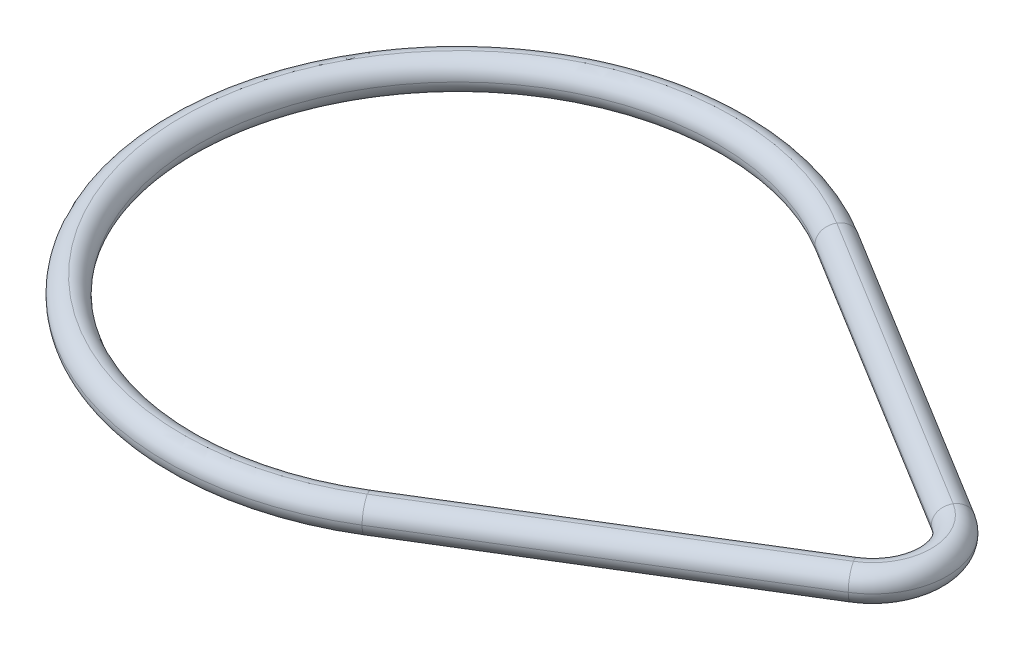
ISO-10303-21;
HEADER;
FILE_DESCRIPTION(('STEP AP214'),'2;1');
FILE_NAME('part.step','',(''),(''),'','','');
FILE_SCHEMA(('AUTOMOTIVE_DESIGN { 1 0 10303 214 1 1 1 1 }'));
ENDSEC;
DATA;
#1=APPLICATION_CONTEXT('core data for automotive mechanical design processes');
#2=APPLICATION_PROTOCOL_DEFINITION('international standard','automotive_design',2000,#1);
#3=PRODUCT_CONTEXT('',#1,'mechanical');
#4=PRODUCT('Part','Part','',(#3));
#5=PRODUCT_RELATED_PRODUCT_CATEGORY('part','',(#4));
#6=PRODUCT_DEFINITION_FORMATION('','',#4);
#7=PRODUCT_DEFINITION_CONTEXT('part definition',#1,'design');
#8=PRODUCT_DEFINITION('design','',#6,#7);
#9=PRODUCT_DEFINITION_SHAPE('','',#8);
#10=(LENGTH_UNIT() NAMED_UNIT(*) SI_UNIT(.MILLI.,.METRE.));
#11=(NAMED_UNIT(*) PLANE_ANGLE_UNIT() SI_UNIT($,.RADIAN.));
#12=(NAMED_UNIT(*) SI_UNIT($,.STERADIAN.) SOLID_ANGLE_UNIT());
#13=UNCERTAINTY_MEASURE_WITH_UNIT(LENGTH_MEASURE(1.E-05),#10,'distance_accuracy_value','');
#14=(GEOMETRIC_REPRESENTATION_CONTEXT(3) GLOBAL_UNCERTAINTY_ASSIGNED_CONTEXT((#13)) GLOBAL_UNIT_ASSIGNED_CONTEXT((#10,
#11,#12)) REPRESENTATION_CONTEXT('',''));
#15=CARTESIAN_POINT('',(0.,0.,0.));
#16=DIRECTION('',(0.,0.,1.));
#17=DIRECTION('',(1.,0.,0.));
#18=AXIS2_PLACEMENT_3D('',#15,#16,#17);
#19=CARTESIAN_POINT('',(6.77384615384616,0.,11.0370969137733));
#20=DIRECTION('',(0.852285475967049,0.,-0.523076923076923));
#21=DIRECTION('',(-0.523076923076923,0.,-0.852285475967049));
#22=AXIS2_PLACEMENT_3D('',#19,#20,#21);
#23=CYLINDRICAL_SURFACE('',#22,0.75);
#24=CARTESIAN_POINT('',(20.9384615384615,0.,2.34378505890938));
#25=DIRECTION('',(0.852285475967049,0.,-0.523076923076922));
#26=DIRECTION('',(-0.523076923076922,0.,-0.852285475967049));
#27=AXIS2_PLACEMENT_3D('',#24,#25,#26);
#28=CIRCLE('',#27,0.75);
#29=CARTESIAN_POINT('',(20.9384615384615,-0.75,2.34378505890938));
#30=VERTEX_POINT('',#29);
#31=CARTESIAN_POINT('',(20.5461538461538,0.,1.7045709519341));
#32=VERTEX_POINT('',#31);
#33=EDGE_CURVE('E12',#30,#32,#28,.T.);
#34=ORIENTED_EDGE('',*,*,#33,.F.);
#35=DIRECTION('',(0.852285475967049,0.,-0.523076923076923));
#36=VECTOR('',#35,1.);
#37=CARTESIAN_POINT('',(6.77384615384616,-0.75,11.0370969137733));
#38=LINE('',#37,#36);
#39=CARTESIAN_POINT('',(6.77384615384614,-0.75,11.0370969137733));
#40=VERTEX_POINT('',#39);
#41=EDGE_CURVE('E215',#40,#30,#38,.T.);
#42=ORIENTED_EDGE('',*,*,#41,.F.);
#43=CARTESIAN_POINT('',(6.77384615384615,0.,11.0370969137733));
#44=DIRECTION('',(-0.852285475967049,0.,0.523076923076923));
#45=DIRECTION('',(0.523076923076923,0.,0.852285475967049));
#46=AXIS2_PLACEMENT_3D('',#43,#44,#45);
#47=CIRCLE('',#46,0.75);
#48=CARTESIAN_POINT('',(6.38153846153846,0.,10.397882806798));
#49=VERTEX_POINT('',#48);
#50=EDGE_CURVE('E212',#49,#40,#47,.T.);
#51=ORIENTED_EDGE('',*,*,#50,.F.);
#52=DIRECTION('',(0.852285475967049,0.,-0.523076923076923));
#53=VECTOR('',#52,1.);
#54=CARTESIAN_POINT('',(20.5461538461538,0.,1.7045709519341));
#55=LINE('',#54,#53);
#56=EDGE_CURVE('E64',#32,#49,#55,.F.);
#57=ORIENTED_EDGE('',*,*,#56,.F.);
#58=EDGE_LOOP('',(#34,#42,#51,#57));
#59=FACE_BOUND('',#58,.T.);
#60=ADVANCED_FACE('F57',(#59),#23,.T.);
#61=CARTESIAN_POINT('',(19.5,0.,0.));
#62=DIRECTION('',(0.,-1.,0.));
#63=DIRECTION('',(0.,0.,-1.));
#64=AXIS2_PLACEMENT_3D('',#61,#62,#63);
#65=TOROIDAL_SURFACE('',#64,2.75,0.75);
#66=CARTESIAN_POINT('',(19.5,-0.75,0.));
#67=DIRECTION('',(0.,-1.,0.));
#68=DIRECTION('',(0.,0.,-1.));
#69=AXIS2_PLACEMENT_3D('',#66,#67,#68);
#70=CIRCLE('',#69,2.75);
#71=CARTESIAN_POINT('',(20.9384615384615,-0.75,-2.34378505890938));
#72=VERTEX_POINT('',#71);
#73=EDGE_CURVE('E210',#30,#72,#70,.F.);
#74=ORIENTED_EDGE('',*,*,#73,.F.);
#75=ORIENTED_EDGE('',*,*,#33,.T.);
#76=CARTESIAN_POINT('',(19.5,0.,0.));
#77=DIRECTION('',(0.,-1.,0.));
#78=DIRECTION('',(0.,0.,-1.));
#79=AXIS2_PLACEMENT_3D('',#76,#77,#78);
#80=CIRCLE('',#79,2.);
#81=CARTESIAN_POINT('',(20.5461538461538,0.,-1.7045709519341));
#82=VERTEX_POINT('',#81);
#83=EDGE_CURVE('E202',#82,#32,#80,.T.);
#84=ORIENTED_EDGE('',*,*,#83,.F.);
#85=CARTESIAN_POINT('',(20.9384615384615,0.,-2.34378505890938));
#86=DIRECTION('',(-0.852285475967049,0.,-0.523076923076923));
#87=DIRECTION('',(-0.523076923076923,0.,0.852285475967049));
#88=AXIS2_PLACEMENT_3D('',#85,#86,#87);
#89=CIRCLE('',#88,0.75);
#90=EDGE_CURVE('E199',#72,#82,#89,.T.);
#91=ORIENTED_EDGE('',*,*,#90,.F.);
#92=EDGE_LOOP('',(#74,#75,#84,#91));
#93=FACE_BOUND('',#92,.T.);
#94=ADVANCED_FACE('F247',(#93),#65,.T.);
#95=CARTESIAN_POINT('',(20.9384615384615,0.,2.34378505890938));
#96=DIRECTION('',(-0.852285475967049,0.,0.523076923076923));
#97=DIRECTION('',(0.523076923076923,0.,0.852285475967049));
#98=AXIS2_PLACEMENT_3D('',#95,#96,#97);
#99=CYLINDRICAL_SURFACE('',#98,0.75);
#100=CARTESIAN_POINT('',(20.9384615384615,0.,2.34378505890938));
#101=DIRECTION('',(0.852285475967049,0.,-0.523076923076923));
#102=DIRECTION('',(-0.523076923076923,0.,-0.852285475967049));
#103=AXIS2_PLACEMENT_3D('',#100,#101,#102);
#104=CIRCLE('',#103,0.75);
#105=CARTESIAN_POINT('',(20.9384615384615,0.75,2.34378505890938));
#106=VERTEX_POINT('',#105);
#107=EDGE_CURVE('E205',#32,#106,#104,.T.);
#108=ORIENTED_EDGE('',*,*,#107,.F.);
#109=ORIENTED_EDGE('',*,*,#56,.T.);
#110=CARTESIAN_POINT('',(6.77384615384615,0.,11.0370969137733));
#111=DIRECTION('',(-0.852285475967049,0.,0.523076923076922));
#112=DIRECTION('',(0.523076923076922,0.,0.852285475967049));
#113=AXIS2_PLACEMENT_3D('',#110,#111,#112);
#114=CIRCLE('',#113,0.75);
#115=CARTESIAN_POINT('',(6.77384615384614,0.75,11.0370969137733));
#116=VERTEX_POINT('',#115);
#117=EDGE_CURVE('E194',#116,#49,#114,.T.);
#118=ORIENTED_EDGE('',*,*,#117,.F.);
#119=DIRECTION('',(0.852285475967049,0.,-0.523076923076923));
#120=VECTOR('',#119,1.);
#121=CARTESIAN_POINT('',(6.77384615384615,0.75,11.0370969137733));
#122=LINE('',#121,#120);
#123=EDGE_CURVE('E191',#106,#116,#122,.F.);
#124=ORIENTED_EDGE('',*,*,#123,.F.);
#125=EDGE_LOOP('',(#108,#109,#118,#124));
#126=FACE_BOUND('',#125,.T.);
#127=ADVANCED_FACE('F219',(#126),#99,.T.);
#128=CARTESIAN_POINT('',(6.77384615384615,0.,11.0370969137733));
#129=DIRECTION('',(-0.852285475967049,0.,0.523076923076923));
#130=DIRECTION('',(0.523076923076923,0.,0.852285475967049));
#131=AXIS2_PLACEMENT_3D('',#128,#129,#130);
#132=CYLINDRICAL_SURFACE('',#131,0.75);
#133=CARTESIAN_POINT('',(6.77384615384614,0.,11.0370969137733));
#134=DIRECTION('',(-0.852285475967049,0.,0.523076923076923));
#135=DIRECTION('',(0.523076923076923,0.,0.852285475967049));
#136=AXIS2_PLACEMENT_3D('',#133,#134,#135);
#137=CIRCLE('',#136,0.75);
#138=CARTESIAN_POINT('',(7.16615384615384,0.,11.6763110207486));
#139=VERTEX_POINT('',#138);
#140=EDGE_CURVE('E185',#40,#139,#137,.T.);
#141=ORIENTED_EDGE('',*,*,#140,.F.);
#142=ORIENTED_EDGE('',*,*,#41,.T.);
#143=CARTESIAN_POINT('',(20.9384615384615,0.,2.34378505890938));
#144=DIRECTION('',(0.852285475967049,0.,-0.523076923076923));
#145=DIRECTION('',(-0.523076923076923,0.,-0.852285475967049));
#146=AXIS2_PLACEMENT_3D('',#143,#144,#145);
#147=CIRCLE('',#146,0.75);
#148=CARTESIAN_POINT('',(21.3307692307692,0.,2.98299916588467));
#149=VERTEX_POINT('',#148);
#150=EDGE_CURVE('E207',#149,#30,#147,.T.);
#151=ORIENTED_EDGE('',*,*,#150,.F.);
#152=DIRECTION('',(0.852285475967049,0.,-0.523076923076923));
#153=VECTOR('',#152,1.);
#154=CARTESIAN_POINT('',(21.3307692307692,0.,2.98299916588467));
#155=LINE('',#154,#153);
#156=EDGE_CURVE('E188',#139,#149,#155,.T.);
#157=ORIENTED_EDGE('',*,*,#156,.F.);
#158=EDGE_LOOP('',(#141,#142,#151,#157));
#159=FACE_BOUND('',#158,.T.);
#160=ADVANCED_FACE('F245',(#159),#132,.T.);
#161=CARTESIAN_POINT('',(0.,0.,0.));
#162=DIRECTION('',(0.,-1.,0.));
#163=DIRECTION('',(0.,0.,-1.));
#164=AXIS2_PLACEMENT_3D('',#161,#162,#163);
#165=TOROIDAL_SURFACE('',#164,12.95,0.75);
#166=CARTESIAN_POINT('',(0.,0.,0.));
#167=DIRECTION('',(0.,-1.,0.));
#168=DIRECTION('',(0.,0.,-1.));
#169=AXIS2_PLACEMENT_3D('',#166,#167,#168);
#170=CIRCLE('',#169,12.2);
#171=CARTESIAN_POINT('',(6.38153846153846,0.,-10.397882806798));
#172=VERTEX_POINT('',#171);
#173=EDGE_CURVE('E125',#49,#172,#170,.T.);
#174=ORIENTED_EDGE('',*,*,#173,.F.);
#175=ORIENTED_EDGE('',*,*,#50,.T.);
#176=CARTESIAN_POINT('',(0.,-0.75,0.));
#177=DIRECTION('',(0.,-1.,0.));
#178=DIRECTION('',(0.,0.,-1.));
#179=AXIS2_PLACEMENT_3D('',#176,#177,#178);
#180=CIRCLE('',#179,12.95);
#181=CARTESIAN_POINT('',(6.77384615384615,-0.75,-11.0370969137733));
#182=VERTEX_POINT('',#181);
#183=EDGE_CURVE('E182',#182,#40,#180,.F.);
#184=ORIENTED_EDGE('',*,*,#183,.F.);
#185=CARTESIAN_POINT('',(6.77384615384615,0.,-11.0370969137733));
#186=DIRECTION('',(0.852285475967049,0.,0.523076923076922));
#187=DIRECTION('',(0.523076923076922,0.,-0.852285475967049));
#188=AXIS2_PLACEMENT_3D('',#185,#186,#187);
#189=CIRCLE('',#188,0.75);
#190=EDGE_CURVE('E197',#172,#182,#189,.T.);
#191=ORIENTED_EDGE('',*,*,#190,.F.);
#192=EDGE_LOOP('',(#174,#175,#184,#191));
#193=FACE_BOUND('',#192,.T.);
#194=ADVANCED_FACE('F224',(#193),#165,.T.);
#195=CARTESIAN_POINT('',(19.5,0.,0.));
#196=DIRECTION('',(0.,-1.,0.));
#197=DIRECTION('',(0.,0.,-1.));
#198=AXIS2_PLACEMENT_3D('',#195,#196,#197);
#199=TOROIDAL_SURFACE('',#198,2.75,0.75);
#200=ORIENTED_EDGE('',*,*,#150,.T.);
#201=ORIENTED_EDGE('',*,*,#73,.T.);
#202=CARTESIAN_POINT('',(20.9384615384615,0.,-2.34378505890938));
#203=DIRECTION('',(-0.852285475967049,0.,-0.523076923076923));
#204=DIRECTION('',(-0.523076923076923,0.,0.852285475967049));
#205=AXIS2_PLACEMENT_3D('',#202,#203,#204);
#206=CIRCLE('',#205,0.75);
#207=CARTESIAN_POINT('',(21.3307692307692,0.,-2.98299916588467));
#208=VERTEX_POINT('',#207);
#209=EDGE_CURVE('E174',#208,#72,#206,.T.);
#210=ORIENTED_EDGE('',*,*,#209,.F.);
#211=CARTESIAN_POINT('',(19.5,0.,0.));
#212=DIRECTION('',(0.,-1.,0.));
#213=DIRECTION('',(0.,0.,-1.));
#214=AXIS2_PLACEMENT_3D('',#211,#212,#213);
#215=CIRCLE('',#214,3.5);
#216=EDGE_CURVE('E171',#149,#208,#215,.F.);
#217=ORIENTED_EDGE('',*,*,#216,.F.);
#218=EDGE_LOOP('',(#200,#201,#210,#217));
#219=FACE_BOUND('',#218,.T.);
#220=ADVANCED_FACE('F246',(#219),#199,.T.);
#221=CARTESIAN_POINT('',(19.5,0.,0.));
#222=DIRECTION('',(0.,-1.,0.));
#223=DIRECTION('',(0.,0.,-1.));
#224=AXIS2_PLACEMENT_3D('',#221,#222,#223);
#225=TOROIDAL_SURFACE('',#224,2.75,0.75);
#226=ORIENTED_EDGE('',*,*,#83,.T.);
#227=ORIENTED_EDGE('',*,*,#107,.T.);
#228=CARTESIAN_POINT('',(19.5,0.75,0.));
#229=DIRECTION('',(0.,-1.,0.));
#230=DIRECTION('',(0.,0.,-1.));
#231=AXIS2_PLACEMENT_3D('',#228,#229,#230);
#232=CIRCLE('',#231,2.75);
#233=CARTESIAN_POINT('',(20.9384615384615,0.75,-2.34378505890938));
#234=VERTEX_POINT('',#233);
#235=EDGE_CURVE('E165',#234,#106,#232,.T.);
#236=ORIENTED_EDGE('',*,*,#235,.F.);
#237=CARTESIAN_POINT('',(20.9384615384615,0.,-2.34378505890938));
#238=DIRECTION('',(-0.852285475967049,0.,-0.523076923076923));
#239=DIRECTION('',(-0.523076923076923,0.,0.852285475967049));
#240=AXIS2_PLACEMENT_3D('',#237,#238,#239);
#241=CIRCLE('',#240,0.75);
#242=EDGE_CURVE('E146',#82,#234,#241,.T.);
#243=ORIENTED_EDGE('',*,*,#242,.F.);
#244=EDGE_LOOP('',(#226,#227,#236,#243));
#245=FACE_BOUND('',#244,.T.);
#246=ADVANCED_FACE('F231',(#245),#225,.T.);
#247=CARTESIAN_POINT('',(6.77384615384615,0.,-11.0370969137733));
#248=DIRECTION('',(-0.852285475967049,0.,-0.523076923076923));
#249=DIRECTION('',(-0.523076923076923,0.,0.852285475967049));
#250=AXIS2_PLACEMENT_3D('',#247,#248,#249);
#251=CYLINDRICAL_SURFACE('',#250,0.75);
#252=DIRECTION('',(-0.852285475967049,0.,-0.523076923076923));
#253=VECTOR('',#252,1.);
#254=CARTESIAN_POINT('',(6.77384615384615,-0.75,-11.0370969137733));
#255=LINE('',#254,#253);
#256=EDGE_CURVE('E177',#72,#182,#255,.T.);
#257=ORIENTED_EDGE('',*,*,#256,.F.);
#258=ORIENTED_EDGE('',*,*,#90,.T.);
#259=DIRECTION('',(-0.852285475967049,0.,-0.523076923076923));
#260=VECTOR('',#259,1.);
#261=CARTESIAN_POINT('',(6.38153846153846,0.,-10.397882806798));
#262=LINE('',#261,#260);
#263=EDGE_CURVE('E130',#172,#82,#262,.F.);
#264=ORIENTED_EDGE('',*,*,#263,.F.);
#265=ORIENTED_EDGE('',*,*,#190,.T.);
#266=EDGE_LOOP('',(#257,#258,#264,#265));
#267=FACE_BOUND('',#266,.T.);
#268=ADVANCED_FACE('F228',(#267),#251,.T.);
#269=CARTESIAN_POINT('',(0.,0.,0.));
#270=DIRECTION('',(0.,-1.,0.));
#271=DIRECTION('',(0.,0.,-1.));
#272=AXIS2_PLACEMENT_3D('',#269,#270,#271);
#273=TOROIDAL_SURFACE('',#272,12.95,0.75);
#274=ORIENTED_EDGE('',*,*,#117,.T.);
#275=ORIENTED_EDGE('',*,*,#173,.T.);
#276=CARTESIAN_POINT('',(6.77384615384615,0.,-11.0370969137733));
#277=DIRECTION('',(0.852285475967049,0.,0.523076923076922));
#278=DIRECTION('',(0.523076923076922,0.,-0.852285475967049));
#279=AXIS2_PLACEMENT_3D('',#276,#277,#278);
#280=CIRCLE('',#279,0.75);
#281=CARTESIAN_POINT('',(6.77384615384615,0.75,-11.0370969137733));
#282=VERTEX_POINT('',#281);
#283=EDGE_CURVE('E118',#282,#172,#280,.T.);
#284=ORIENTED_EDGE('',*,*,#283,.F.);
#285=CARTESIAN_POINT('',(0.,0.75,0.));
#286=DIRECTION('',(0.,-1.,0.));
#287=DIRECTION('',(0.,0.,-1.));
#288=AXIS2_PLACEMENT_3D('',#285,#286,#287);
#289=CIRCLE('',#288,12.95);
#290=EDGE_CURVE('E122',#116,#282,#289,.T.);
#291=ORIENTED_EDGE('',*,*,#290,.F.);
#292=EDGE_LOOP('',(#274,#275,#284,#291));
#293=FACE_BOUND('',#292,.T.);
#294=ADVANCED_FACE('F121',(#293),#273,.T.);
#295=CARTESIAN_POINT('',(6.77384615384615,0.,11.0370969137733));
#296=DIRECTION('',(0.852285475967049,0.,-0.523076923076923));
#297=DIRECTION('',(-0.523076923076923,0.,-0.852285475967049));
#298=AXIS2_PLACEMENT_3D('',#295,#296,#297);
#299=CYLINDRICAL_SURFACE('',#298,0.75);
#300=CARTESIAN_POINT('',(6.77384615384614,0.,11.0370969137733));
#301=DIRECTION('',(-0.852285475967049,0.,0.523076923076923));
#302=DIRECTION('',(0.523076923076923,0.,0.852285475967049));
#303=AXIS2_PLACEMENT_3D('',#300,#301,#302);
#304=CIRCLE('',#303,0.75);
#305=EDGE_CURVE('E139',#139,#116,#304,.T.);
#306=ORIENTED_EDGE('',*,*,#305,.F.);
#307=ORIENTED_EDGE('',*,*,#156,.T.);
#308=CARTESIAN_POINT('',(20.9384615384615,0.,2.34378505890938));
#309=DIRECTION('',(0.852285475967049,0.,-0.523076923076923));
#310=DIRECTION('',(-0.523076923076923,0.,-0.852285475967049));
#311=AXIS2_PLACEMENT_3D('',#308,#309,#310);
#312=CIRCLE('',#311,0.75);
#313=EDGE_CURVE('E168',#106,#149,#312,.T.);
#314=ORIENTED_EDGE('',*,*,#313,.F.);
#315=ORIENTED_EDGE('',*,*,#123,.T.);
#316=EDGE_LOOP('',(#306,#307,#314,#315));
#317=FACE_BOUND('',#316,.T.);
#318=ADVANCED_FACE('F244',(#317),#299,.T.);
#319=CARTESIAN_POINT('',(0.,0.,0.));
#320=DIRECTION('',(0.,-1.,0.));
#321=DIRECTION('',(0.,0.,-1.));
#322=AXIS2_PLACEMENT_3D('',#319,#320,#321);
#323=TOROIDAL_SURFACE('',#322,12.95,0.75);
#324=CARTESIAN_POINT('',(6.77384615384615,0.,-11.0370969137733));
#325=DIRECTION('',(0.852285475967049,0.,0.523076923076922));
#326=DIRECTION('',(0.523076923076922,0.,-0.852285475967049));
#327=AXIS2_PLACEMENT_3D('',#324,#325,#326);
#328=CIRCLE('',#327,0.75);
#329=CARTESIAN_POINT('',(7.16615384615384,0.,-11.6763110207486));
#330=VERTEX_POINT('',#329);
#331=EDGE_CURVE('E180',#182,#330,#328,.T.);
#332=ORIENTED_EDGE('',*,*,#331,.F.);
#333=ORIENTED_EDGE('',*,*,#183,.T.);
#334=ORIENTED_EDGE('',*,*,#140,.T.);
#335=CARTESIAN_POINT('',(0.,0.,0.));
#336=DIRECTION('',(0.,-1.,0.));
#337=DIRECTION('',(0.,0.,-1.));
#338=AXIS2_PLACEMENT_3D('',#335,#336,#337);
#339=CIRCLE('',#338,13.7);
#340=EDGE_CURVE('E160',#330,#139,#339,.F.);
#341=ORIENTED_EDGE('',*,*,#340,.F.);
#342=EDGE_LOOP('',(#332,#333,#334,#341));
#343=FACE_BOUND('',#342,.T.);
#344=ADVANCED_FACE('F241',(#343),#323,.T.);
#345=CARTESIAN_POINT('',(6.77384615384615,0.,-11.0370969137733));
#346=DIRECTION('',(0.852285475967049,0.,0.523076923076923));
#347=DIRECTION('',(0.523076923076923,0.,-0.852285475967049));
#348=AXIS2_PLACEMENT_3D('',#345,#346,#347);
#349=CYLINDRICAL_SURFACE('',#348,0.75);
#350=ORIENTED_EDGE('',*,*,#256,.T.);
#351=ORIENTED_EDGE('',*,*,#331,.T.);
#352=DIRECTION('',(-0.852285475967049,0.,-0.523076923076923));
#353=VECTOR('',#352,1.);
#354=CARTESIAN_POINT('',(7.16615384615384,0.,-11.6763110207486));
#355=LINE('',#354,#353);
#356=EDGE_CURVE('E155',#208,#330,#355,.T.);
#357=ORIENTED_EDGE('',*,*,#356,.F.);
#358=ORIENTED_EDGE('',*,*,#209,.T.);
#359=EDGE_LOOP('',(#350,#351,#357,#358));
#360=FACE_BOUND('',#359,.T.);
#361=ADVANCED_FACE('F238',(#360),#349,.T.);
#362=CARTESIAN_POINT('',(19.5,0.,0.));
#363=DIRECTION('',(0.,-1.,0.));
#364=DIRECTION('',(0.,0.,-1.));
#365=AXIS2_PLACEMENT_3D('',#362,#363,#364);
#366=TOROIDAL_SURFACE('',#365,2.75,0.75);
#367=ORIENTED_EDGE('',*,*,#313,.T.);
#368=ORIENTED_EDGE('',*,*,#216,.T.);
#369=CARTESIAN_POINT('',(20.9384615384615,0.,-2.34378505890939));
#370=DIRECTION('',(-0.852285475967049,0.,-0.523076923076923));
#371=DIRECTION('',(-0.523076923076923,0.,0.852285475967049));
#372=AXIS2_PLACEMENT_3D('',#369,#370,#371);
#373=CIRCLE('',#372,0.75);
#374=EDGE_CURVE('E150',#234,#208,#373,.T.);
#375=ORIENTED_EDGE('',*,*,#374,.F.);
#376=ORIENTED_EDGE('',*,*,#235,.T.);
#377=EDGE_LOOP('',(#367,#368,#375,#376));
#378=FACE_BOUND('',#377,.T.);
#379=ADVANCED_FACE('F233',(#378),#366,.T.);
#380=CARTESIAN_POINT('',(6.77384615384615,0.,-11.0370969137733));
#381=DIRECTION('',(0.852285475967049,0.,0.523076923076923));
#382=DIRECTION('',(0.523076923076923,0.,-0.852285475967049));
#383=AXIS2_PLACEMENT_3D('',#380,#381,#382);
#384=CYLINDRICAL_SURFACE('',#383,0.75);
#385=ORIENTED_EDGE('',*,*,#263,.T.);
#386=ORIENTED_EDGE('',*,*,#242,.T.);
#387=DIRECTION('',(-0.852285475967049,0.,-0.523076923076923));
#388=VECTOR('',#387,1.);
#389=CARTESIAN_POINT('',(20.9384615384615,0.75,-2.34378505890938));
#390=LINE('',#389,#388);
#391=EDGE_CURVE('E143',#282,#234,#390,.F.);
#392=ORIENTED_EDGE('',*,*,#391,.F.);
#393=ORIENTED_EDGE('',*,*,#283,.T.);
#394=EDGE_LOOP('',(#385,#386,#392,#393));
#395=FACE_BOUND('',#394,.T.);
#396=ADVANCED_FACE('F144',(#395),#384,.T.);
#397=CARTESIAN_POINT('',(0.,0.,0.));
#398=DIRECTION('',(0.,-1.,0.));
#399=DIRECTION('',(0.,0.,-1.));
#400=AXIS2_PLACEMENT_3D('',#397,#398,#399);
#401=TOROIDAL_SURFACE('',#400,12.95,0.75);
#402=ORIENTED_EDGE('',*,*,#305,.T.);
#403=ORIENTED_EDGE('',*,*,#290,.T.);
#404=CARTESIAN_POINT('',(6.77384615384615,0.,-11.0370969137733));
#405=DIRECTION('',(0.852285475967049,0.,0.523076923076922));
#406=DIRECTION('',(0.523076923076922,0.,-0.852285475967049));
#407=AXIS2_PLACEMENT_3D('',#404,#405,#406);
#408=CIRCLE('',#407,0.75);
#409=EDGE_CURVE('E137',#330,#282,#408,.T.);
#410=ORIENTED_EDGE('',*,*,#409,.F.);
#411=ORIENTED_EDGE('',*,*,#340,.T.);
#412=EDGE_LOOP('',(#402,#403,#410,#411));
#413=FACE_BOUND('',#412,.T.);
#414=ADVANCED_FACE('F134',(#413),#401,.T.);
#415=CARTESIAN_POINT('',(6.77384615384615,0.,-11.0370969137733));
#416=DIRECTION('',(-0.852285475967049,0.,-0.523076923076923));
#417=DIRECTION('',(-0.523076923076923,0.,0.852285475967049));
#418=AXIS2_PLACEMENT_3D('',#415,#416,#417);
#419=CYLINDRICAL_SURFACE('',#418,0.75);
#420=ORIENTED_EDGE('',*,*,#374,.T.);
#421=ORIENTED_EDGE('',*,*,#356,.T.);
#422=ORIENTED_EDGE('',*,*,#409,.T.);
#423=ORIENTED_EDGE('',*,*,#391,.T.);
#424=EDGE_LOOP('',(#420,#421,#422,#423));
#425=FACE_BOUND('',#424,.T.);
#426=ADVANCED_FACE('F153',(#425),#419,.T.);
#427=CLOSED_SHELL('',(#60,#94,#127,#160,#194,#220,#246,#268,#294,#318,#344,#361,#379,#396,#414,#426));
#428=MANIFOLD_SOLID_BREP('B2',#427);
#429=ADVANCED_BREP_SHAPE_REPRESENTATION('',(#18,#428),#14);
#430=SHAPE_DEFINITION_REPRESENTATION(#9,#429);
ENDSEC;
END-ISO-10303-21;
